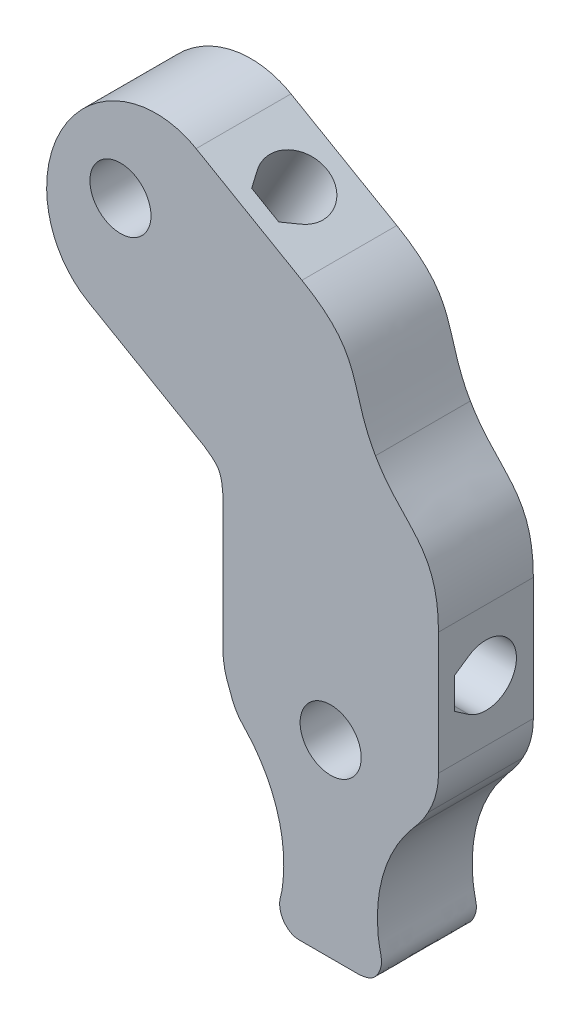
ISO-10303-21;
HEADER;
FILE_DESCRIPTION(('STEP AP214'),'2;1');
FILE_NAME('part.step','',(''),(''),'','','');
FILE_SCHEMA(('AUTOMOTIVE_DESIGN { 1 0 10303 214 1 1 1 1 }'));
ENDSEC;
DATA;
#1=APPLICATION_CONTEXT('core data for automotive mechanical design processes');
#2=APPLICATION_PROTOCOL_DEFINITION('international standard','automotive_design',2000,#1);
#3=PRODUCT_CONTEXT('',#1,'mechanical');
#4=PRODUCT('Part','Part','',(#3));
#5=PRODUCT_RELATED_PRODUCT_CATEGORY('part','',(#4));
#6=PRODUCT_DEFINITION_FORMATION('','',#4);
#7=PRODUCT_DEFINITION_CONTEXT('part definition',#1,'design');
#8=PRODUCT_DEFINITION('design','',#6,#7);
#9=PRODUCT_DEFINITION_SHAPE('','',#8);
#10=(LENGTH_UNIT() NAMED_UNIT(*) SI_UNIT(.MILLI.,.METRE.));
#11=(NAMED_UNIT(*) PLANE_ANGLE_UNIT() SI_UNIT($,.RADIAN.));
#12=(NAMED_UNIT(*) SI_UNIT($,.STERADIAN.) SOLID_ANGLE_UNIT());
#13=UNCERTAINTY_MEASURE_WITH_UNIT(LENGTH_MEASURE(1.E-05),#10,'distance_accuracy_value','');
#14=(GEOMETRIC_REPRESENTATION_CONTEXT(3) GLOBAL_UNCERTAINTY_ASSIGNED_CONTEXT((#13)) GLOBAL_UNIT_ASSIGNED_CONTEXT((#10,
#11,#12)) REPRESENTATION_CONTEXT('',''));
#15=CARTESIAN_POINT('',(0.,0.,0.));
#16=DIRECTION('',(0.,0.,1.));
#17=DIRECTION('',(1.,0.,0.));
#18=AXIS2_PLACEMENT_3D('',#15,#16,#17);
#19=CARTESIAN_POINT('',(0.,-30.2749907475931,6.6));
#20=DIRECTION('',(0.,0.,1.));
#21=DIRECTION('',(1.,0.,0.));
#22=AXIS2_PLACEMENT_3D('',#19,#20,#21);
#23=ELLIPSE('',#22,15.,12.681);
#24=DIRECTION('',(0.,0.,-1.));
#25=VECTOR('',#24,1.);
#26=SURFACE_OF_LINEAR_EXTRUSION('',#23,#25);
#27=DIRECTION('',(0.,0.,-1.));
#28=VECTOR('',#27,1.);
#29=CARTESIAN_POINT('',(-14.0996529992365,-34.6022320103913,0.));
#30=LINE('',#29,#28);
#31=CARTESIAN_POINT('',(-14.099652999238,-34.6022320103866,6.6));
#32=VERTEX_POINT('',#31);
#33=CARTESIAN_POINT('',(-14.099652999238,-34.6022320103866,-6.6));
#34=VERTEX_POINT('',#33);
#35=EDGE_CURVE('E12',#32,#34,#30,.T.);
#36=ORIENTED_EDGE('',*,*,#35,.F.);
#37=CARTESIAN_POINT('',(-15.,-30.2749907475931,6.6));
#38=VERTEX_POINT('',#37);
#39=EDGE_CURVE('E312',#38,#32,#23,.T.);
#40=ORIENTED_EDGE('',*,*,#39,.F.);
#41=DIRECTION('',(0.,0.,-1.));
#42=VECTOR('',#41,1.);
#43=CARTESIAN_POINT('',(-15.,-30.2749907475931,6.6));
#44=LINE('',#43,#42);
#45=CARTESIAN_POINT('',(-15.,-30.2749907475931,-6.6));
#46=VERTEX_POINT('',#45);
#47=EDGE_CURVE('E151',#38,#46,#44,.T.);
#48=ORIENTED_EDGE('',*,*,#47,.T.);
#49=CARTESIAN_POINT('',(0.,-30.2749907475931,-6.6));
#50=DIRECTION('',(0.,0.,1.));
#51=DIRECTION('',(1.,0.,0.));
#52=AXIS2_PLACEMENT_3D('',#49,#50,#51);
#53=ELLIPSE('',#52,15.,12.681);
#54=EDGE_CURVE('E486',#46,#34,#53,.T.);
#55=ORIENTED_EDGE('',*,*,#54,.T.);
#56=EDGE_LOOP('',(#36,#40,#48,#55));
#57=FACE_BOUND('',#56,.T.);
#58=ADVANCED_FACE('F140',(#57),#26,.F.);
#59=CARTESIAN_POINT('',(0.,-30.2749907475931,6.6));
#60=DIRECTION('',(0.,0.,1.));
#61=DIRECTION('',(1.,0.,0.));
#62=AXIS2_PLACEMENT_3D('',#59,#60,#61);
#63=PLANE('',#62);
#64=CARTESIAN_POINT('',(13.5215570159766,-35.7647228182937,6.6));
#65=VERTEX_POINT('',#64);
#66=CARTESIAN_POINT('',(15.,-30.2749907475932,6.6));
#67=VERTEX_POINT('',#66);
#68=EDGE_CURVE('E550',#65,#67,#23,.T.);
#69=ORIENTED_EDGE('',*,*,#68,.T.);
#70=DIRECTION('',(0.,-1.,0.));
#71=VECTOR('',#70,1.);
#72=CARTESIAN_POINT('',(15.,-13.2749907475933,6.6));
#73=LINE('',#72,#71);
#74=CARTESIAN_POINT('',(15.,-13.2749907475933,6.6));
#75=VERTEX_POINT('',#74);
#76=EDGE_CURVE('E558',#75,#67,#73,.T.);
#77=ORIENTED_EDGE('',*,*,#76,.F.);
#78=CARTESIAN_POINT('',(15.,-13.2749907475933,6.6));
#79=CARTESIAN_POINT('',(15.,-3.02796405891336,6.6));
#80=CARTESIAN_POINT('',(10.1063570974954,-3.10451473088878,6.6));
#81=CARTESIAN_POINT('',(6.2354735114352,3.60005231035195,6.6));
#82=B_SPLINE_CURVE_WITH_KNOTS('',3,(#78,#79,#80,#81),.UNSPECIFIED.,.F.,.F.,(4,4),(0.,1.),.UNSPECIFIED.);
#83=CARTESIAN_POINT('',(6.23547351143524,3.60005231035187,6.6));
#84=VERTEX_POINT('',#83);
#85=EDGE_CURVE('E572',#75,#84,#82,.T.);
#86=ORIENTED_EDGE('',*,*,#85,.T.);
#87=CARTESIAN_POINT('',(-3.99647922241902,19.6278764305633,6.6));
#88=CARTESIAN_POINT('',(4.87770620323494,14.5043630862233,6.6));
#89=CARTESIAN_POINT('',(2.36458992537499,10.3046193515926,6.6));
#90=CARTESIAN_POINT('',(6.23547351143524,3.60005231035187,6.6));
#91=B_SPLINE_CURVE_WITH_KNOTS('',3,(#87,#88,#89,#90),.UNSPECIFIED.,.F.,.F.,(4,4),(0.,1.),.UNSPECIFIED.);
#92=CARTESIAN_POINT('',(-3.99647922241902,19.6278764305633,6.6));
#93=VERTEX_POINT('',#92);
#94=EDGE_CURVE('E576',#93,#84,#91,.T.);
#95=ORIENTED_EDGE('',*,*,#94,.F.);
#96=DIRECTION('',(-0.866025403784441,0.499999999999996,0.));
#97=VECTOR('',#96,1.);
#98=CARTESIAN_POINT('',(-3.99647922241902,19.6278764305633,6.6));
#99=LINE('',#98,#97);
#100=CARTESIAN_POINT('',(-18.7189110867546,28.1278764305632,6.6));
#101=VERTEX_POINT('',#100);
#102=EDGE_CURVE('E535',#93,#101,#99,.T.);
#103=ORIENTED_EDGE('',*,*,#102,.T.);
#104=CARTESIAN_POINT('',(-26.2189110867545,15.1374953737965,6.6));
#105=DIRECTION('',(0.,0.,-1.));
#106=DIRECTION('',(0.49999999999999,0.866025403784445,0.));
#107=AXIS2_PLACEMENT_3D('',#104,#105,#106);
#108=ELLIPSE('',#107,15.,12.681);
#109=CARTESIAN_POINT('',(-33.7189110867545,2.14711431703005,6.6));
#110=VERTEX_POINT('',#109);
#111=EDGE_CURVE('E530',#110,#101,#108,.T.);
#112=ORIENTED_EDGE('',*,*,#111,.F.);
#113=DIRECTION('',(-0.866025403784438,0.500000000000002,0.));
#114=VECTOR('',#113,1.);
#115=CARTESIAN_POINT('',(-18.996479222419,-6.35288568297003,6.6));
#116=LINE('',#115,#114);
#117=CARTESIAN_POINT('',(-18.996479222419,-6.35288568297003,6.6));
#118=VERTEX_POINT('',#117);
#119=EDGE_CURVE('E534',#118,#110,#116,.T.);
#120=ORIENTED_EDGE('',*,*,#119,.F.);
#121=CARTESIAN_POINT('',(-18.996479222419,-6.35288568297003,6.6));
#122=CARTESIAN_POINT('',(-16.8990015137658,-7.4384009621155,6.6));
#123=CARTESIAN_POINT('',(-15.9160989893475,-8.40880751728888,6.6));
#124=CARTESIAN_POINT('',(-15.5781947047634,-8.99407490628362,6.6));
#125=B_SPLINE_CURVE_WITH_KNOTS('',3,(#121,#122,#123,#124),.UNSPECIFIED.,.F.,.F.,(4,4),(0.,1.),.UNSPECIFIED.);
#126=CARTESIAN_POINT('',(-15.5781947047634,-8.99407490628362,6.6));
#127=VERTEX_POINT('',#126);
#128=EDGE_CURVE('E499',#118,#127,#125,.T.);
#129=ORIENTED_EDGE('',*,*,#128,.T.);
#130=CARTESIAN_POINT('',(-15.,-13.2749907475931,6.6));
#131=CARTESIAN_POINT('',(-14.8913449536095,-10.9157641284551,6.6));
#132=CARTESIAN_POINT('',(-15.2402904201794,-9.57934229527836,6.6));
#133=CARTESIAN_POINT('',(-15.5781947047634,-8.99407490628362,6.6));
#134=B_SPLINE_CURVE_WITH_KNOTS('',3,(#130,#131,#132,#133),.UNSPECIFIED.,.F.,.F.,(4,4),(0.,1.),.UNSPECIFIED.);
#135=CARTESIAN_POINT('',(-15.,-13.2749907475931,6.6));
#136=VERTEX_POINT('',#135);
#137=EDGE_CURVE('E440',#136,#127,#134,.T.);
#138=ORIENTED_EDGE('',*,*,#137,.F.);
#139=DIRECTION('',(0.,-1.,0.));
#140=VECTOR('',#139,1.);
#141=CARTESIAN_POINT('',(-15.,-13.2749907475931,6.6));
#142=LINE('',#141,#140);
#143=EDGE_CURVE('E446',#136,#38,#142,.T.);
#144=ORIENTED_EDGE('',*,*,#143,.T.);
#145=ORIENTED_EDGE('',*,*,#39,.T.);
#146=CARTESIAN_POINT('',(-15.,-30.2749907475931,6.6));
#147=CARTESIAN_POINT('',(-14.2865523426086,-35.6426745631836,6.6));
#148=CARTESIAN_POINT('',(-12.5655065854139,-37.6555101928118,6.6));
#149=B_SPLINE_CURVE_WITH_KNOTS('',2,(#146,#147,#148),.UNSPECIFIED.,.F.,.F.,(3,3),(0.,1.),.UNSPECIFIED.);
#150=CARTESIAN_POINT('',(-12.5655065854139,-37.6555101928118,6.6));
#151=VERTEX_POINT('',#150);
#152=EDGE_CURVE('E304',#32,#151,#149,.T.);
#153=ORIENTED_EDGE('',*,*,#152,.T.);
#154=CARTESIAN_POINT('',(-4.10506744026298,-60.0556221573633,6.6));
#155=CARTESIAN_POINT('',(-4.45974012122379,-60.0586342130783,6.6));
#156=CARTESIAN_POINT('',(-5.3097351628524,-60.0367639684987,6.6));
#157=CARTESIAN_POINT('',(-6.71086481535362,-58.9880064881459,6.6));
#158=CARTESIAN_POINT('',(-7.147854357688,-57.5204737854024,6.6));
#159=CARTESIAN_POINT('',(-7.07235122847969,-56.5128627220298,6.6));
#160=CARTESIAN_POINT('',(-6.77003596733258,-55.5054039661602,6.6));
#161=CARTESIAN_POINT('',(-6.60636225986336,-54.0160115728545,6.6));
#162=CARTESIAN_POINT('',(-6.48655713896897,-52.0263053493098,6.6));
#163=CARTESIAN_POINT('',(-6.59066820123709,-50.0303307362697,6.6));
#164=CARTESIAN_POINT('',(-6.88819338677669,-48.0560177348259,6.6));
#165=CARTESIAN_POINT('',(-7.38153080490078,-46.1204443240831,6.6));
#166=CARTESIAN_POINT('',(-8.06300977398602,-44.2434766765483,6.6));
#167=CARTESIAN_POINT('',(-8.92957940953793,-42.4433750059924,6.6));
#168=CARTESIAN_POINT('',(-9.97736628640268,-40.7456102045273,6.6));
#169=CARTESIAN_POINT('',(-11.0140943295074,-39.3219788827491,6.6));
#170=CARTESIAN_POINT('',(-11.9646821855968,-38.3696440749146,6.6));
#171=CARTESIAN_POINT('',(-12.4063386771834,-37.85325361509,6.6));
#172=CARTESIAN_POINT('',(-12.5655065854139,-37.6555101928118,6.6));
#173=B_SPLINE_CURVE_WITH_KNOTS('',3,(#154,#155,#156,#157,#158,#159,#160,#161,#162,#163,#164,
#165,#166,#167,#168,#169,#170,#171,#172),.UNSPECIFIED.,.F.,.F.,(4,1,1,1,1,1,1,1,1,1,1,1,1,1,1,1,
4),(0.,0.0276595465617291,0.0833367375974978,0.139000984117367,0.159159574138172,
0.173630482588283,0.233516851180277,0.293375318961064,0.353233786741972,0.413120141176518,
0.472984650221981,0.532856343906258,0.592727518195394,0.652578768876378,0.712466067856139,
0.750774856026475,0.773630262322771),.UNSPECIFIED.);
#174=CARTESIAN_POINT('',(-4.10506744026298,-60.0556221573633,6.6));
#175=VERTEX_POINT('',#174);
#176=EDGE_CURVE('E309',#175,#151,#173,.T.);
#177=ORIENTED_EDGE('',*,*,#176,.F.);
#178=DIRECTION('',(-1.,0.,0.));
#179=VECTOR('',#178,1.);
#180=CARTESIAN_POINT('',(4.02176212476966,-60.0556221573632,6.6));
#181=LINE('',#180,#179);
#182=CARTESIAN_POINT('',(4.02176212476966,-60.0556221573632,6.6));
#183=VERTEX_POINT('',#182);
#184=EDGE_CURVE('E340',#183,#175,#181,.T.);
#185=ORIENTED_EDGE('',*,*,#184,.F.);
#186=CARTESIAN_POINT('',(11.5500336561995,-38.5506329070779,6.6));
#187=CARTESIAN_POINT('',(11.2218418277643,-38.9150988814468,6.6));
#188=CARTESIAN_POINT('',(10.9059553927574,-39.4003247277423,6.6));
#189=CARTESIAN_POINT('',(9.69314969657623,-40.9809836822724,6.6));
#190=CARTESIAN_POINT('',(8.6672807259953,-42.740319033252,6.6));
#191=CARTESIAN_POINT('',(7.67661927421356,-45.075200557631,6.6));
#192=CARTESIAN_POINT('',(7.08898158808682,-46.9825237443114,6.6));
#193=CARTESIAN_POINT('',(6.69361949445008,-48.9400702496253,6.6));
#194=CARTESIAN_POINT('',(6.49244524652297,-50.927900735681,6.6));
#195=CARTESIAN_POINT('',(6.50457602458208,-52.9226684538639,6.6));
#196=CARTESIAN_POINT('',(6.64408363801613,-54.747020658482,6.6));
#197=CARTESIAN_POINT('',(6.99868025882105,-56.0861809714479,6.6));
#198=CARTESIAN_POINT('',(7.14935911050724,-57.4154972317194,6.6));
#199=CARTESIAN_POINT('',(6.58169133728172,-58.921504763906,6.6));
#200=CARTESIAN_POINT('',(5.56989677384647,-59.8597206957537,6.6));
#201=CARTESIAN_POINT('',(4.06778531677864,-60.0621199701103,6.6));
#202=CARTESIAN_POINT('',(4.02176212476966,-60.0556221573632,6.6));
#203=B_SPLINE_CURVE_WITH_KNOTS('',3,(#186,#187,#188,#189,#190,#191,#192,#193,#194,#195,#196,
#197,#198,#199,#200,#201,#202),.UNSPECIFIED.,.F.,.F.,(4,1,1,1,1,1,1,1,1,1,1,1,1,1,4),
(0.416114245345297,0.45364675697124,0.468506228789404,0.553584024284118,0.600937776952884,
0.648267117097113,0.695592694166175,0.742926149296005,0.790263011776007,0.837596466905927,
0.872691441009403,0.888628806676144,0.932636916887851,0.976655261023808,1.),.UNSPECIFIED.);
#204=CARTESIAN_POINT('',(11.5500336561995,-38.5506329070779,6.6));
#205=VERTEX_POINT('',#204);
#206=EDGE_CURVE('E346',#205,#183,#203,.T.);
#207=ORIENTED_EDGE('',*,*,#206,.F.);
#208=CARTESIAN_POINT('',(15.,-30.2749907475932,6.6));
#209=CARTESIAN_POINT('',(14.7198907893044,-35.0920850558884,6.6));
#210=CARTESIAN_POINT('',(11.5500336561995,-38.5506329070779,6.6));
#211=B_SPLINE_CURVE_WITH_KNOTS('',2,(#208,#209,#210),.UNSPECIFIED.,.F.,.F.,(3,3),(0.,1.),.UNSPECIFIED.);
#212=EDGE_CURVE('E352',#65,#205,#211,.T.);
#213=ORIENTED_EDGE('',*,*,#212,.F.);
#214=EDGE_LOOP('',(#69,#77,#86,#95,#103,#112,#120,#129,#138,#144,#145,#153,#177,#185,#207,#213));
#215=FACE_BOUND('',#214,.T.);
#216=CARTESIAN_POINT('',(-29.25,16.8874953737966,6.6));
#217=DIRECTION('',(0.,0.,1.));
#218=DIRECTION('',(1.,0.,0.));
#219=AXIS2_PLACEMENT_3D('',#216,#217,#218);
#220=CIRCLE('',#219,4.25000000000001);
#221=CARTESIAN_POINT('',(-25.,16.8874953737966,6.6));
#222=VERTEX_POINT('',#221);
#223=EDGE_CURVE('E493',#222,#222,#220,.F.);
#224=ORIENTED_EDGE('',*,*,#223,.T.);
#225=EDGE_LOOP('',(#224));
#226=FACE_BOUND('',#225,.T.);
#227=CARTESIAN_POINT('',(0.,-33.7749907475931,6.6));
#228=DIRECTION('',(0.,0.,1.));
#229=DIRECTION('',(1.,0.,0.));
#230=AXIS2_PLACEMENT_3D('',#227,#228,#229);
#231=CIRCLE('',#230,4.25000000000001);
#232=CARTESIAN_POINT('',(4.25000000000001,-33.7749907475931,6.6));
#233=VERTEX_POINT('',#232);
#234=EDGE_CURVE('E726',#233,#233,#231,.T.);
#235=ORIENTED_EDGE('',*,*,#234,.F.);
#236=EDGE_LOOP('',(#235));
#237=FACE_BOUND('',#236,.T.);
#238=ADVANCED_FACE('F306',(#215,#226,#237),#63,.T.);
#239=CARTESIAN_POINT('',(0.,-30.2749907475931,-6.6));
#240=DIRECTION('',(0.,0.,1.));
#241=DIRECTION('',(1.,0.,0.));
#242=AXIS2_PLACEMENT_3D('',#239,#240,#241);
#243=PLANE('',#242);
#244=CARTESIAN_POINT('',(13.5215570159766,-35.7647228182937,-6.6));
#245=VERTEX_POINT('',#244);
#246=CARTESIAN_POINT('',(15.,-30.2749907475932,-6.6));
#247=VERTEX_POINT('',#246);
#248=EDGE_CURVE('E489',#245,#247,#53,.T.);
#249=ORIENTED_EDGE('',*,*,#248,.F.);
#250=CARTESIAN_POINT('',(15.,-30.2749907475932,-6.6));
#251=CARTESIAN_POINT('',(14.7198907893044,-35.0920850558884,-6.6));
#252=CARTESIAN_POINT('',(11.5500336561995,-38.5506329070779,-6.6));
#253=B_SPLINE_CURVE_WITH_KNOTS('',2,(#250,#251,#252),.UNSPECIFIED.,.F.,.F.,(3,3),(0.,1.),.UNSPECIFIED.);
#254=CARTESIAN_POINT('',(11.5500336561995,-38.5506329070779,-6.6));
#255=VERTEX_POINT('',#254);
#256=EDGE_CURVE('E159',#245,#255,#253,.T.);
#257=ORIENTED_EDGE('',*,*,#256,.T.);
#258=CARTESIAN_POINT('',(4.02176212476966,-60.0556221573632,-6.6));
#259=CARTESIAN_POINT('',(4.06778531677864,-60.0621199701103,-6.6));
#260=CARTESIAN_POINT('',(5.56989677384647,-59.8597206957537,-6.6));
#261=CARTESIAN_POINT('',(6.58169133728172,-58.921504763906,-6.6));
#262=CARTESIAN_POINT('',(7.14935911050724,-57.4154972317194,-6.6));
#263=CARTESIAN_POINT('',(6.99868025882105,-56.0861809714479,-6.6));
#264=CARTESIAN_POINT('',(6.64408363801613,-54.747020658482,-6.6));
#265=CARTESIAN_POINT('',(6.50457602458208,-52.9226684538639,-6.6));
#266=CARTESIAN_POINT('',(6.49244524652297,-50.927900735681,-6.6));
#267=CARTESIAN_POINT('',(6.69361949445008,-48.9400702496253,-6.6));
#268=CARTESIAN_POINT('',(7.08898158808682,-46.9825237443114,-6.6));
#269=CARTESIAN_POINT('',(7.67661927421356,-45.075200557631,-6.6));
#270=CARTESIAN_POINT('',(8.6672807259953,-42.740319033252,-6.6));
#271=CARTESIAN_POINT('',(9.69314969657623,-40.9809836822724,-6.6));
#272=CARTESIAN_POINT('',(10.9059553927574,-39.4003247277423,-6.6));
#273=CARTESIAN_POINT('',(11.2218418277643,-38.9150988814468,-6.6));
#274=CARTESIAN_POINT('',(11.5500336561995,-38.5506329070779,-6.6));
#275=B_SPLINE_CURVE_WITH_KNOTS('',3,(#258,#259,#260,#261,#262,#263,#264,#265,#266,#267,#268,
#269,#270,#271,#272,#273,#274),.UNSPECIFIED.,.F.,.F.,(4,1,1,1,1,1,1,1,1,1,1,1,1,1,4),
(0.416114245345297,0.439458984321489,0.483477328457446,0.527485438669153,0.543422804335894,
0.57851777843937,0.625851233569291,0.673188096049293,0.720521551179122,0.767847128248184,
0.815176468392414,0.86253022106118,0.947608016555894,0.962467488374058,1.),.UNSPECIFIED.);
#276=CARTESIAN_POINT('',(4.02176212476966,-60.0556221573632,-6.6));
#277=VERTEX_POINT('',#276);
#278=EDGE_CURVE('E329',#255,#277,#275,.F.);
#279=ORIENTED_EDGE('',*,*,#278,.T.);
#280=DIRECTION('',(-1.,0.,0.));
#281=VECTOR('',#280,1.);
#282=CARTESIAN_POINT('',(4.02176212476966,-60.0556221573632,-6.6));
#283=LINE('',#282,#281);
#284=CARTESIAN_POINT('',(-4.10506744026298,-60.0556221573633,-6.6));
#285=VERTEX_POINT('',#284);
#286=EDGE_CURVE('E315',#277,#285,#283,.T.);
#287=ORIENTED_EDGE('',*,*,#286,.T.);
#288=CARTESIAN_POINT('',(-4.10506744026298,-60.0556221573633,-6.6));
#289=CARTESIAN_POINT('',(-4.45974012122379,-60.0586342130783,-6.6));
#290=CARTESIAN_POINT('',(-5.3097351628524,-60.0367639684987,-6.6));
#291=CARTESIAN_POINT('',(-6.71086481535362,-58.9880064881459,-6.6));
#292=CARTESIAN_POINT('',(-7.147854357688,-57.5204737854024,-6.6));
#293=CARTESIAN_POINT('',(-7.07235122847969,-56.5128627220298,-6.6));
#294=CARTESIAN_POINT('',(-6.77003596733258,-55.5054039661602,-6.6));
#295=CARTESIAN_POINT('',(-6.60636225986336,-54.0160115728545,-6.6));
#296=CARTESIAN_POINT('',(-6.48655713896897,-52.0263053493098,-6.6));
#297=CARTESIAN_POINT('',(-6.59066820123709,-50.0303307362697,-6.6));
#298=CARTESIAN_POINT('',(-6.88819338677669,-48.0560177348259,-6.6));
#299=CARTESIAN_POINT('',(-7.38153080490078,-46.1204443240831,-6.6));
#300=CARTESIAN_POINT('',(-8.06300977398602,-44.2434766765483,-6.6));
#301=CARTESIAN_POINT('',(-8.92957940953793,-42.4433750059924,-6.6));
#302=CARTESIAN_POINT('',(-9.97736628640268,-40.7456102045273,-6.6));
#303=CARTESIAN_POINT('',(-11.0140943295074,-39.3219788827491,-6.6));
#304=CARTESIAN_POINT('',(-11.9646821855968,-38.3696440749146,-6.6));
#305=CARTESIAN_POINT('',(-12.4063386771834,-37.85325361509,-6.6));
#306=CARTESIAN_POINT('',(-12.5655065854139,-37.6555101928118,-6.6));
#307=B_SPLINE_CURVE_WITH_KNOTS('',3,(#288,#289,#290,#291,#292,#293,#294,#295,#296,#297,#298,
#299,#300,#301,#302,#303,#304,#305,#306),.UNSPECIFIED.,.F.,.F.,(4,1,1,1,1,1,1,1,1,1,1,1,1,1,1,1,
4),(0.,0.0276595465617291,0.0833367375974978,0.139000984117367,0.159159574138172,
0.173630482588283,0.233516851180277,0.293375318961064,0.353233786741972,0.413120141176518,
0.472984650221981,0.532856343906258,0.592727518195394,0.652578768876378,0.712466067856139,
0.750774856026475,0.773630262322771),.UNSPECIFIED.);
#308=CARTESIAN_POINT('',(-12.5655065854139,-37.6555101928118,-6.6));
#309=VERTEX_POINT('',#308);
#310=EDGE_CURVE('E336',#285,#309,#307,.T.);
#311=ORIENTED_EDGE('',*,*,#310,.T.);
#312=CARTESIAN_POINT('',(-15.,-30.2749907475931,-6.6));
#313=CARTESIAN_POINT('',(-14.2865523426086,-35.6426745631836,-6.6));
#314=CARTESIAN_POINT('',(-12.5655065854139,-37.6555101928118,-6.6));
#315=B_SPLINE_CURVE_WITH_KNOTS('',2,(#312,#313,#314),.UNSPECIFIED.,.F.,.F.,(3,3),(0.,1.),.UNSPECIFIED.);
#316=EDGE_CURVE('E321',#34,#309,#315,.T.);
#317=ORIENTED_EDGE('',*,*,#316,.F.);
#318=ORIENTED_EDGE('',*,*,#54,.F.);
#319=DIRECTION('',(0.,-1.,0.));
#320=VECTOR('',#319,1.);
#321=CARTESIAN_POINT('',(-15.,-13.2749907475931,-6.6));
#322=LINE('',#321,#320);
#323=CARTESIAN_POINT('',(-15.,-13.2749907475931,-6.6));
#324=VERTEX_POINT('',#323);
#325=EDGE_CURVE('E490',#324,#46,#322,.T.);
#326=ORIENTED_EDGE('',*,*,#325,.F.);
#327=CARTESIAN_POINT('',(-15.,-13.2749907475931,-6.6));
#328=CARTESIAN_POINT('',(-14.8913449536095,-10.9157641284551,-6.6));
#329=CARTESIAN_POINT('',(-15.2402904201794,-9.57934229527836,-6.6));
#330=CARTESIAN_POINT('',(-15.5781947047634,-8.99407490628362,-6.6));
#331=B_SPLINE_CURVE_WITH_KNOTS('',3,(#327,#328,#329,#330),.UNSPECIFIED.,.F.,.F.,(4,4),(0.,1.),.UNSPECIFIED.);
#332=CARTESIAN_POINT('',(-15.5781947047634,-8.99407490628362,-6.6));
#333=VERTEX_POINT('',#332);
#334=EDGE_CURVE('E441',#324,#333,#331,.T.);
#335=ORIENTED_EDGE('',*,*,#334,.T.);
#336=CARTESIAN_POINT('',(-18.996479222419,-6.35288568297003,-6.6));
#337=CARTESIAN_POINT('',(-16.8990015137658,-7.4384009621155,-6.6));
#338=CARTESIAN_POINT('',(-15.9160989893475,-8.40880751728888,-6.6));
#339=CARTESIAN_POINT('',(-15.5781947047634,-8.99407490628362,-6.6));
#340=B_SPLINE_CURVE_WITH_KNOTS('',3,(#336,#337,#338,#339),.UNSPECIFIED.,.F.,.F.,(4,4),(0.,1.),.UNSPECIFIED.);
#341=CARTESIAN_POINT('',(-18.996479222419,-6.35288568297003,-6.6));
#342=VERTEX_POINT('',#341);
#343=EDGE_CURVE('E447',#342,#333,#340,.T.);
#344=ORIENTED_EDGE('',*,*,#343,.F.);
#345=DIRECTION('',(-0.866025403784438,0.500000000000002,0.));
#346=VECTOR('',#345,1.);
#347=CARTESIAN_POINT('',(-18.996479222419,-6.35288568297003,-6.6));
#348=LINE('',#347,#346);
#349=CARTESIAN_POINT('',(-33.7189110867545,2.14711431703005,-6.6));
#350=VERTEX_POINT('',#349);
#351=EDGE_CURVE('E455',#342,#350,#348,.T.);
#352=ORIENTED_EDGE('',*,*,#351,.T.);
#353=CARTESIAN_POINT('',(-26.2189110867545,15.1374953737965,-6.6));
#354=DIRECTION('',(0.,0.,-1.));
#355=DIRECTION('',(0.49999999999999,0.866025403784445,0.));
#356=AXIS2_PLACEMENT_3D('',#353,#354,#355);
#357=ELLIPSE('',#356,15.,12.681);
#358=CARTESIAN_POINT('',(-18.7189110867546,28.1278764305632,-6.6));
#359=VERTEX_POINT('',#358);
#360=EDGE_CURVE('E461',#350,#359,#357,.T.);
#361=ORIENTED_EDGE('',*,*,#360,.T.);
#362=DIRECTION('',(-0.866025403784441,0.499999999999996,0.));
#363=VECTOR('',#362,1.);
#364=CARTESIAN_POINT('',(-3.99647922241902,19.6278764305633,-6.6));
#365=LINE('',#364,#363);
#366=CARTESIAN_POINT('',(-3.99647922241902,19.6278764305633,-6.6));
#367=VERTEX_POINT('',#366);
#368=EDGE_CURVE('E464',#367,#359,#365,.T.);
#369=ORIENTED_EDGE('',*,*,#368,.F.);
#370=CARTESIAN_POINT('',(-3.99647922241902,19.6278764305633,-6.6));
#371=CARTESIAN_POINT('',(4.87770620323494,14.5043630862233,-6.6));
#372=CARTESIAN_POINT('',(2.36458992537499,10.3046193515926,-6.6));
#373=CARTESIAN_POINT('',(6.23547351143524,3.60005231035187,-6.6));
#374=B_SPLINE_CURVE_WITH_KNOTS('',3,(#370,#371,#372,#373),.UNSPECIFIED.,.F.,.F.,(4,4),(0.,1.),.UNSPECIFIED.);
#375=CARTESIAN_POINT('',(6.23547351143524,3.60005231035187,-6.6));
#376=VERTEX_POINT('',#375);
#377=EDGE_CURVE('E467',#367,#376,#374,.T.);
#378=ORIENTED_EDGE('',*,*,#377,.T.);
#379=CARTESIAN_POINT('',(15.,-13.2749907475933,-6.6));
#380=CARTESIAN_POINT('',(15.,-3.02796405891336,-6.6));
#381=CARTESIAN_POINT('',(10.1063570974954,-3.10451473088878,-6.6));
#382=CARTESIAN_POINT('',(6.2354735114352,3.60005231035195,-6.6));
#383=B_SPLINE_CURVE_WITH_KNOTS('',3,(#379,#380,#381,#382),.UNSPECIFIED.,.F.,.F.,(4,4),(0.,1.),.UNSPECIFIED.);
#384=CARTESIAN_POINT('',(15.,-13.2749907475933,-6.6));
#385=VERTEX_POINT('',#384);
#386=EDGE_CURVE('E472',#385,#376,#383,.T.);
#387=ORIENTED_EDGE('',*,*,#386,.F.);
#388=DIRECTION('',(0.,-1.,0.));
#389=VECTOR('',#388,1.);
#390=CARTESIAN_POINT('',(15.,-13.2749907475933,-6.6));
#391=LINE('',#390,#389);
#392=EDGE_CURVE('E480',#385,#247,#391,.T.);
#393=ORIENTED_EDGE('',*,*,#392,.T.);
#394=EDGE_LOOP('',(#249,#257,#279,#287,#311,#317,#318,#326,#335,#344,#352,#361,#369,#378,#387,#393));
#395=FACE_BOUND('',#394,.T.);
#396=CARTESIAN_POINT('',(-29.25,16.8874953737966,-6.6));
#397=DIRECTION('',(0.,0.,1.));
#398=DIRECTION('',(1.,0.,0.));
#399=AXIS2_PLACEMENT_3D('',#396,#397,#398);
#400=CIRCLE('',#399,4.25000000000001);
#401=CARTESIAN_POINT('',(-25.,16.8874953737966,-6.6));
#402=VERTEX_POINT('',#401);
#403=EDGE_CURVE('E554',#402,#402,#400,.F.);
#404=ORIENTED_EDGE('',*,*,#403,.F.);
#405=EDGE_LOOP('',(#404));
#406=FACE_BOUND('',#405,.T.);
#407=CARTESIAN_POINT('',(0.,-33.7749907475931,-6.6));
#408=DIRECTION('',(0.,0.,1.));
#409=DIRECTION('',(1.,0.,0.));
#410=AXIS2_PLACEMENT_3D('',#407,#408,#409);
#411=CIRCLE('',#410,4.25000000000001);
#412=CARTESIAN_POINT('',(4.25000000000001,-33.7749907475931,-6.6));
#413=VERTEX_POINT('',#412);
#414=EDGE_CURVE('E725',#413,#413,#411,.T.);
#415=ORIENTED_EDGE('',*,*,#414,.T.);
#416=EDGE_LOOP('',(#415));
#417=FACE_BOUND('',#416,.T.);
#418=ADVANCED_FACE('F416',(#395,#406,#417),#243,.F.);
#419=CARTESIAN_POINT('',(-15.,-13.2749907475931,6.6));
#420=DIRECTION('',(1.,0.,0.));
#421=DIRECTION('',(0.,1.,0.));
#422=AXIS2_PLACEMENT_3D('',#419,#420,#421);
#423=PLANE('',#422);
#424=DIRECTION('',(0.,-1.,0.));
#425=VECTOR('',#424,1.);
#426=CARTESIAN_POINT('',(-15.,-23.9499907475933,4.35));
#427=LINE('',#426,#425);
#428=CARTESIAN_POINT('',(-15.,-19.5999907475933,4.35));
#429=VERTEX_POINT('',#428);
#430=CARTESIAN_POINT('',(-15.,-23.9499907475933,4.35));
#431=VERTEX_POINT('',#430);
#432=EDGE_CURVE('E696',#429,#431,#427,.T.);
#433=ORIENTED_EDGE('',*,*,#432,.T.);
#434=DIRECTION('',(0.,0.564188482461599,0.825646023582551));
#435=VECTOR('',#434,1.);
#436=CARTESIAN_POINT('',(-15.,-23.9499907475933,4.34999999999999));
#437=LINE('',#436,#435);
#438=CARTESIAN_POINT('',(-15.,-25.2839863478191,2.39780105046179));
#439=VERTEX_POINT('',#438);
#440=EDGE_CURVE('E699',#439,#431,#437,.T.);
#441=ORIENTED_EDGE('',*,*,#440,.F.);
#442=CARTESIAN_POINT('',(-15.,-21.7749907475933,0.));
#443=DIRECTION('',(1.,0.,0.));
#444=DIRECTION('',(0.,1.,0.));
#445=AXIS2_PLACEMENT_3D('',#442,#443,#444);
#446=CIRCLE('',#445,4.25);
#447=CARTESIAN_POINT('',(-15.,-18.2659951473674,2.39780105046179));
#448=VERTEX_POINT('',#447);
#449=EDGE_CURVE('E716',#448,#439,#446,.F.);
#450=ORIENTED_EDGE('',*,*,#449,.F.);
#451=DIRECTION('',(0.,-0.564188482461599,0.825646023582551));
#452=VECTOR('',#451,1.);
#453=CARTESIAN_POINT('',(-15.,-19.5999907475933,4.35000000000001));
#454=LINE('',#453,#452);
#455=EDGE_CURVE('E693',#448,#429,#454,.T.);
#456=ORIENTED_EDGE('',*,*,#455,.T.);
#457=EDGE_LOOP('',(#433,#441,#450,#456));
#458=FACE_BOUND('',#457,.T.);
#459=ORIENTED_EDGE('',*,*,#325,.T.);
#460=ORIENTED_EDGE('',*,*,#47,.F.);
#461=ORIENTED_EDGE('',*,*,#143,.F.);
#462=DIRECTION('',(0.,0.,-1.));
#463=VECTOR('',#462,1.);
#464=CARTESIAN_POINT('',(-15.,-13.2749907475931,6.6));
#465=LINE('',#464,#463);
#466=EDGE_CURVE('E438',#136,#324,#465,.T.);
#467=ORIENTED_EDGE('',*,*,#466,.T.);
#468=EDGE_LOOP('',(#459,#460,#461,#467));
#469=FACE_BOUND('',#468,.T.);
#470=ADVANCED_FACE('F142',(#458,#469),#423,.F.);
#471=ORIENTED_EDGE('',*,*,#68,.F.);
#472=DIRECTION('',(0.,0.,-1.));
#473=VECTOR('',#472,1.);
#474=CARTESIAN_POINT('',(13.5215570159766,-35.7647228182937,0.));
#475=LINE('',#474,#473);
#476=EDGE_CURVE('E368',#65,#245,#475,.T.);
#477=ORIENTED_EDGE('',*,*,#476,.T.);
#478=ORIENTED_EDGE('',*,*,#248,.T.);
#479=DIRECTION('',(0.,0.,-1.));
#480=VECTOR('',#479,1.);
#481=CARTESIAN_POINT('',(15.,-30.2749907475932,6.6));
#482=LINE('',#481,#480);
#483=EDGE_CURVE('E421',#67,#247,#482,.T.);
#484=ORIENTED_EDGE('',*,*,#483,.F.);
#485=EDGE_LOOP('',(#471,#477,#478,#484));
#486=FACE_BOUND('',#485,.T.);
#487=ADVANCED_FACE('F560',(#486),#26,.F.);
#488=CARTESIAN_POINT('',(15.,-13.2749907475933,6.6));
#489=DIRECTION('',(1.,0.,0.));
#490=DIRECTION('',(0.,1.,0.));
#491=AXIS2_PLACEMENT_3D('',#488,#489,#490);
#492=PLANE('',#491);
#493=DIRECTION('',(0.,-0.564188482461599,-0.825646023582551));
#494=VECTOR('',#493,1.);
#495=CARTESIAN_POINT('',(15.,-23.9499907475932,4.35));
#496=LINE('',#495,#494);
#497=CARTESIAN_POINT('',(15.,-23.9499907475932,4.35));
#498=VERTEX_POINT('',#497);
#499=CARTESIAN_POINT('',(15.,-25.2839863478191,2.39780105046179));
#500=VERTEX_POINT('',#499);
#501=EDGE_CURVE('E702',#498,#500,#496,.T.);
#502=ORIENTED_EDGE('',*,*,#501,.F.);
#503=DIRECTION('',(0.,1.,0.));
#504=VECTOR('',#503,1.);
#505=CARTESIAN_POINT('',(15.,-23.9499907475932,4.35));
#506=LINE('',#505,#504);
#507=CARTESIAN_POINT('',(15.,-19.5999907475932,4.35));
#508=VERTEX_POINT('',#507);
#509=EDGE_CURVE('E710',#498,#508,#506,.T.);
#510=ORIENTED_EDGE('',*,*,#509,.T.);
#511=DIRECTION('',(0.,0.564188482461599,-0.825646023582551));
#512=VECTOR('',#511,1.);
#513=CARTESIAN_POINT('',(15.,-19.5999907475932,4.35));
#514=LINE('',#513,#512);
#515=CARTESIAN_POINT('',(15.,-18.2659951473674,2.39780105046179));
#516=VERTEX_POINT('',#515);
#517=EDGE_CURVE('E707',#508,#516,#514,.T.);
#518=ORIENTED_EDGE('',*,*,#517,.T.);
#519=CARTESIAN_POINT('',(15.,-21.7749907475932,0.));
#520=DIRECTION('',(1.,0.,0.));
#521=DIRECTION('',(0.,1.,0.));
#522=AXIS2_PLACEMENT_3D('',#519,#520,#521);
#523=CIRCLE('',#522,4.25);
#524=EDGE_CURVE('E704',#500,#516,#523,.T.);
#525=ORIENTED_EDGE('',*,*,#524,.F.);
#526=EDGE_LOOP('',(#502,#510,#518,#525));
#527=FACE_BOUND('',#526,.T.);
#528=ORIENTED_EDGE('',*,*,#392,.F.);
#529=DIRECTION('',(0.,0.,-1.));
#530=VECTOR('',#529,1.);
#531=CARTESIAN_POINT('',(15.,-13.2749907475933,6.6));
#532=LINE('',#531,#530);
#533=EDGE_CURVE('E424',#75,#385,#532,.T.);
#534=ORIENTED_EDGE('',*,*,#533,.F.);
#535=ORIENTED_EDGE('',*,*,#76,.T.);
#536=ORIENTED_EDGE('',*,*,#483,.T.);
#537=EDGE_LOOP('',(#528,#534,#535,#536));
#538=FACE_BOUND('',#537,.T.);
#539=ADVANCED_FACE('F563',(#527,#538),#492,.T.);
#540=DIRECTION('',(0.,0.,-1.));
#541=VECTOR('',#540,1.);
#542=SURFACE_OF_LINEAR_EXTRUSION('',#82,#541);
#543=ORIENTED_EDGE('',*,*,#386,.T.);
#544=DIRECTION('',(0.,0.,-1.));
#545=VECTOR('',#544,1.);
#546=CARTESIAN_POINT('',(6.23547351143524,3.60005231035187,6.6));
#547=LINE('',#546,#545);
#548=EDGE_CURVE('E426',#84,#376,#547,.T.);
#549=ORIENTED_EDGE('',*,*,#548,.F.);
#550=ORIENTED_EDGE('',*,*,#85,.F.);
#551=ORIENTED_EDGE('',*,*,#533,.T.);
#552=EDGE_LOOP('',(#543,#549,#550,#551));
#553=FACE_BOUND('',#552,.T.);
#554=ADVANCED_FACE('F567',(#553),#542,.F.);
#555=DIRECTION('',(0.,0.,-1.));
#556=VECTOR('',#555,1.);
#557=SURFACE_OF_LINEAR_EXTRUSION('',#91,#556);
#558=ORIENTED_EDGE('',*,*,#377,.F.);
#559=DIRECTION('',(0.,0.,-1.));
#560=VECTOR('',#559,1.);
#561=CARTESIAN_POINT('',(-3.99647922241902,19.6278764305633,6.6));
#562=LINE('',#561,#560);
#563=EDGE_CURVE('E428',#93,#367,#562,.T.);
#564=ORIENTED_EDGE('',*,*,#563,.F.);
#565=ORIENTED_EDGE('',*,*,#94,.T.);
#566=ORIENTED_EDGE('',*,*,#548,.T.);
#567=EDGE_LOOP('',(#558,#564,#565,#566));
#568=FACE_BOUND('',#567,.T.);
#569=ADVANCED_FACE('F570',(#568),#557,.T.);
#570=CARTESIAN_POINT('',(-3.99647922241902,19.6278764305633,6.6));
#571=DIRECTION('',(-0.499999999999996,-0.866025403784441,0.));
#572=DIRECTION('',(0.866025403784441,-0.499999999999996,0.));
#573=AXIS2_PLACEMENT_3D('',#570,#571,#572);
#574=PLANE('',#573);
#575=CARTESIAN_POINT('',(-11.3576951545868,23.8778764305632,0.));
#576=DIRECTION('',(0.499999999999996,0.866025403784441,0.));
#577=DIRECTION('',(-0.866025403784441,0.499999999999996,0.));
#578=AXIS2_PLACEMENT_3D('',#575,#576,#577);
#579=CIRCLE('',#578,4.25);
#580=CARTESIAN_POINT('',(-8.31881582302338,22.1233786304503,2.39780105046179));
#581=VERTEX_POINT('',#580);
#582=CARTESIAN_POINT('',(-14.3965744861502,25.6323742306761,2.39780105046179));
#583=VERTEX_POINT('',#582);
#584=EDGE_CURVE('E673',#581,#583,#579,.T.);
#585=ORIENTED_EDGE('',*,*,#584,.F.);
#586=DIRECTION('',(0.488601558334337,-0.282094241230797,-0.825646023582551));
#587=VECTOR('',#586,1.);
#588=CARTESIAN_POINT('',(-9.47408990135564,22.7903764305632,4.35));
#589=LINE('',#588,#587);
#590=CARTESIAN_POINT('',(-9.47408990135564,22.7903764305632,4.35));
#591=VERTEX_POINT('',#590);
#592=EDGE_CURVE('E167',#591,#581,#589,.T.);
#593=ORIENTED_EDGE('',*,*,#592,.F.);
#594=DIRECTION('',(-0.866025403784441,0.499999999999996,0.));
#595=VECTOR('',#594,1.);
#596=CARTESIAN_POINT('',(-9.47408990135564,22.7903764305632,4.35));
#597=LINE('',#596,#595);
#598=CARTESIAN_POINT('',(-13.241300407818,24.9653764305632,4.35));
#599=VERTEX_POINT('',#598);
#600=EDGE_CURVE('E679',#591,#599,#597,.T.);
#601=ORIENTED_EDGE('',*,*,#600,.T.);
#602=DIRECTION('',(-0.488601558334337,0.282094241230796,-0.825646023582551));
#603=VECTOR('',#602,1.);
#604=CARTESIAN_POINT('',(-13.241300407818,24.9653764305632,4.35));
#605=LINE('',#604,#603);
#606=EDGE_CURVE('E676',#599,#583,#605,.T.);
#607=ORIENTED_EDGE('',*,*,#606,.T.);
#608=EDGE_LOOP('',(#585,#593,#601,#607));
#609=FACE_BOUND('',#608,.T.);
#610=ORIENTED_EDGE('',*,*,#368,.T.);
#611=DIRECTION('',(0.,0.,-1.));
#612=VECTOR('',#611,1.);
#613=CARTESIAN_POINT('',(-18.7189110867546,28.1278764305632,6.6));
#614=LINE('',#613,#612);
#615=EDGE_CURVE('E430',#101,#359,#614,.T.);
#616=ORIENTED_EDGE('',*,*,#615,.F.);
#617=ORIENTED_EDGE('',*,*,#102,.F.);
#618=ORIENTED_EDGE('',*,*,#563,.T.);
#619=EDGE_LOOP('',(#610,#616,#617,#618));
#620=FACE_BOUND('',#619,.T.);
#621=ADVANCED_FACE('F527',(#609,#620),#574,.F.);
#622=DIRECTION('',(0.,0.,-1.));
#623=VECTOR('',#622,1.);
#624=SURFACE_OF_LINEAR_EXTRUSION('',#108,#623);
#625=ORIENTED_EDGE('',*,*,#360,.F.);
#626=DIRECTION('',(0.,0.,-1.));
#627=VECTOR('',#626,1.);
#628=CARTESIAN_POINT('',(-33.7189110867545,2.14711431703005,6.6));
#629=LINE('',#628,#627);
#630=EDGE_CURVE('E432',#110,#350,#629,.T.);
#631=ORIENTED_EDGE('',*,*,#630,.F.);
#632=ORIENTED_EDGE('',*,*,#111,.T.);
#633=ORIENTED_EDGE('',*,*,#615,.T.);
#634=EDGE_LOOP('',(#625,#631,#632,#633));
#635=FACE_BOUND('',#634,.T.);
#636=ADVANCED_FACE('F522',(#635),#624,.T.);
#637=CARTESIAN_POINT('',(-18.996479222419,-6.35288568297003,6.6));
#638=DIRECTION('',(-0.500000000000002,-0.866025403784438,0.));
#639=DIRECTION('',(0.866025403784438,-0.500000000000002,0.));
#640=AXIS2_PLACEMENT_3D('',#637,#638,#639);
#641=PLANE('',#640);
#642=DIRECTION('',(0.488601558334335,-0.282094241230801,-0.825646023582551));
#643=VECTOR('',#642,1.);
#644=CARTESIAN_POINT('',(-24.4740899013554,-3.19038568297006,4.34999999999986));
#645=LINE('',#644,#643);
#646=CARTESIAN_POINT('',(-24.4740899013555,-3.19038568297002,4.35));
#647=VERTEX_POINT('',#646);
#648=CARTESIAN_POINT('',(-23.3188158230233,-3.85738348308295,2.39780105046179));
#649=VERTEX_POINT('',#648);
#650=EDGE_CURVE('E669',#647,#649,#645,.T.);
#651=ORIENTED_EDGE('',*,*,#650,.T.);
#652=CARTESIAN_POINT('',(-26.3576951545867,-2.10288568297002,0.));
#653=DIRECTION('',(-0.500000000000002,-0.866025403784438,0.));
#654=DIRECTION('',(0.866025403784438,-0.500000000000002,0.));
#655=AXIS2_PLACEMENT_3D('',#652,#653,#654);
#656=CIRCLE('',#655,4.25);
#657=CARTESIAN_POINT('',(-29.3965744861501,-0.348387882857091,2.39780105046179));
#658=VERTEX_POINT('',#657);
#659=EDGE_CURVE('E685',#649,#658,#656,.F.);
#660=ORIENTED_EDGE('',*,*,#659,.T.);
#661=DIRECTION('',(-0.488601558334335,0.2820942412308,-0.825646023582551));
#662=VECTOR('',#661,1.);
#663=CARTESIAN_POINT('',(-28.2413004078177,-1.01538568297006,4.35000000000014));
#664=LINE('',#663,#662);
#665=CARTESIAN_POINT('',(-28.2413004078178,-1.01538568297001,4.35));
#666=VERTEX_POINT('',#665);
#667=EDGE_CURVE('E664',#666,#658,#664,.T.);
#668=ORIENTED_EDGE('',*,*,#667,.F.);
#669=DIRECTION('',(-0.866025403784438,0.500000000000002,0.));
#670=VECTOR('',#669,1.);
#671=CARTESIAN_POINT('',(-24.4740899013553,-3.19038568297018,4.35));
#672=LINE('',#671,#670);
#673=EDGE_CURVE('E667',#647,#666,#672,.T.);
#674=ORIENTED_EDGE('',*,*,#673,.F.);
#675=EDGE_LOOP('',(#651,#660,#668,#674));
#676=FACE_BOUND('',#675,.T.);
#677=ORIENTED_EDGE('',*,*,#351,.F.);
#678=DIRECTION('',(0.,0.,-1.));
#679=VECTOR('',#678,1.);
#680=CARTESIAN_POINT('',(-18.996479222419,-6.35288568297003,6.6));
#681=LINE('',#680,#679);
#682=EDGE_CURVE('E434',#118,#342,#681,.T.);
#683=ORIENTED_EDGE('',*,*,#682,.F.);
#684=ORIENTED_EDGE('',*,*,#119,.T.);
#685=ORIENTED_EDGE('',*,*,#630,.T.);
#686=EDGE_LOOP('',(#677,#683,#684,#685));
#687=FACE_BOUND('',#686,.T.);
#688=ADVANCED_FACE('F518',(#676,#687),#641,.T.);
#689=DIRECTION('',(0.,0.,-1.));
#690=VECTOR('',#689,1.);
#691=SURFACE_OF_LINEAR_EXTRUSION('',#125,#690);
#692=ORIENTED_EDGE('',*,*,#343,.T.);
#693=DIRECTION('',(0.,0.,-1.));
#694=VECTOR('',#693,1.);
#695=CARTESIAN_POINT('',(-15.5781947047634,-8.99407490628362,6.6));
#696=LINE('',#695,#694);
#697=EDGE_CURVE('E436',#127,#333,#696,.T.);
#698=ORIENTED_EDGE('',*,*,#697,.F.);
#699=ORIENTED_EDGE('',*,*,#128,.F.);
#700=ORIENTED_EDGE('',*,*,#682,.T.);
#701=EDGE_LOOP('',(#692,#698,#699,#700));
#702=FACE_BOUND('',#701,.T.);
#703=ADVANCED_FACE('F512',(#702),#691,.F.);
#704=DIRECTION('',(0.,0.,-1.));
#705=VECTOR('',#704,1.);
#706=SURFACE_OF_LINEAR_EXTRUSION('',#134,#705);
#707=ORIENTED_EDGE('',*,*,#334,.F.);
#708=ORIENTED_EDGE('',*,*,#466,.F.);
#709=ORIENTED_EDGE('',*,*,#137,.T.);
#710=ORIENTED_EDGE('',*,*,#697,.T.);
#711=EDGE_LOOP('',(#707,#708,#709,#710));
#712=FACE_BOUND('',#711,.T.);
#713=ADVANCED_FACE('F508',(#712),#706,.T.);
#714=CARTESIAN_POINT('',(-29.25,16.8874953737966,6.6));
#715=DIRECTION('',(0.,0.,-1.));
#716=DIRECTION('',(-1.,0.,0.));
#717=AXIS2_PLACEMENT_3D('',#714,#715,#716);
#718=CYLINDRICAL_SURFACE('',#717,4.25000000000001);
#719=ORIENTED_EDGE('',*,*,#223,.F.);
#720=EDGE_LOOP('',(#719));
#721=FACE_BOUND('',#720,.T.);
#722=ORIENTED_EDGE('',*,*,#403,.T.);
#723=EDGE_LOOP('',(#722));
#724=FACE_BOUND('',#723,.T.);
#725=ADVANCED_FACE('F511',(#721,#724),#718,.F.);
#726=CARTESIAN_POINT('',(0.,-33.7749907475931,6.6));
#727=DIRECTION('',(0.,0.,-1.));
#728=DIRECTION('',(-1.,0.,0.));
#729=AXIS2_PLACEMENT_3D('',#726,#727,#728);
#730=CYLINDRICAL_SURFACE('',#729,4.25000000000001);
#731=ORIENTED_EDGE('',*,*,#234,.T.);
#732=EDGE_LOOP('',(#731));
#733=FACE_BOUND('',#732,.T.);
#734=ORIENTED_EDGE('',*,*,#414,.F.);
#735=EDGE_LOOP('',(#734));
#736=FACE_BOUND('',#735,.T.);
#737=ADVANCED_FACE('F606',(#733,#736),#730,.F.);
#738=CARTESIAN_POINT('',(-39.5186260904682,-23.9499907475933,4.35));
#739=DIRECTION('',(0.,-0.825646023582551,0.564188482461599));
#740=DIRECTION('',(0.,-0.564188482461599,-0.825646023582551));
#741=AXIS2_PLACEMENT_3D('',#738,#739,#740);
#742=PLANE('',#741);
#743=ORIENTED_EDGE('',*,*,#440,.T.);
#744=DIRECTION('',(1.,0.,0.));
#745=VECTOR('',#744,1.);
#746=CARTESIAN_POINT('',(-39.5186260904682,-23.9499907475933,4.35));
#747=LINE('',#746,#745);
#748=EDGE_CURVE('E714',#431,#498,#747,.T.);
#749=ORIENTED_EDGE('',*,*,#748,.T.);
#750=ORIENTED_EDGE('',*,*,#501,.T.);
#751=DIRECTION('',(1.,0.,0.));
#752=VECTOR('',#751,1.);
#753=CARTESIAN_POINT('',(-39.5186260904682,-25.2839863478191,2.39780105046179));
#754=LINE('',#753,#752);
#755=EDGE_CURVE('E713',#439,#500,#754,.T.);
#756=ORIENTED_EDGE('',*,*,#755,.F.);
#757=EDGE_LOOP('',(#743,#749,#750,#756));
#758=FACE_BOUND('',#757,.T.);
#759=ADVANCED_FACE('F610',(#758),#742,.F.);
#760=CARTESIAN_POINT('',(-39.5186260904682,-23.9499907475933,4.35));
#761=DIRECTION('',(0.,0.,-1.));
#762=DIRECTION('',(-1.,0.,0.));
#763=AXIS2_PLACEMENT_3D('',#760,#761,#762);
#764=PLANE('',#763);
#765=DIRECTION('',(1.,0.,0.));
#766=VECTOR('',#765,1.);
#767=CARTESIAN_POINT('',(-39.5186260904682,-19.5999907475933,4.35));
#768=LINE('',#767,#766);
#769=EDGE_CURVE('E717',#429,#508,#768,.T.);
#770=ORIENTED_EDGE('',*,*,#769,.T.);
#771=ORIENTED_EDGE('',*,*,#509,.F.);
#772=ORIENTED_EDGE('',*,*,#748,.F.);
#773=ORIENTED_EDGE('',*,*,#432,.F.);
#774=EDGE_LOOP('',(#770,#771,#772,#773));
#775=FACE_BOUND('',#774,.T.);
#776=ADVANCED_FACE('F614',(#775),#764,.T.);
#777=CARTESIAN_POINT('',(-39.5186260904682,-19.5999907475933,4.35));
#778=DIRECTION('',(0.,-0.825646023582551,-0.564188482461599));
#779=DIRECTION('',(0.,0.564188482461599,-0.825646023582551));
#780=AXIS2_PLACEMENT_3D('',#777,#778,#779);
#781=PLANE('',#780);
#782=DIRECTION('',(1.,0.,0.));
#783=VECTOR('',#782,1.);
#784=CARTESIAN_POINT('',(-39.5186260904682,-18.2659951473675,2.39780105046179));
#785=LINE('',#784,#783);
#786=EDGE_CURVE('E719',#448,#516,#785,.T.);
#787=ORIENTED_EDGE('',*,*,#786,.T.);
#788=ORIENTED_EDGE('',*,*,#517,.F.);
#789=ORIENTED_EDGE('',*,*,#769,.F.);
#790=ORIENTED_EDGE('',*,*,#455,.F.);
#791=EDGE_LOOP('',(#787,#788,#789,#790));
#792=FACE_BOUND('',#791,.T.);
#793=ADVANCED_FACE('F620',(#792),#781,.T.);
#794=CARTESIAN_POINT('',(-39.5186260904682,-21.7749907475933,0.));
#795=DIRECTION('',(1.,0.,0.));
#796=DIRECTION('',(0.,1.,0.));
#797=AXIS2_PLACEMENT_3D('',#794,#795,#796);
#798=CYLINDRICAL_SURFACE('',#797,4.25);
#799=ORIENTED_EDGE('',*,*,#449,.T.);
#800=ORIENTED_EDGE('',*,*,#755,.T.);
#801=ORIENTED_EDGE('',*,*,#524,.T.);
#802=ORIENTED_EDGE('',*,*,#786,.F.);
#803=EDGE_LOOP('',(#799,#800,#801,#802));
#804=FACE_BOUND('',#803,.T.);
#805=ADVANCED_FACE('F616',(#804),#798,.F.);
#806=CARTESIAN_POINT('',(-45.4546690527468,-39.5298147454004,4.35));
#807=DIRECTION('',(0.715030430956097,-0.412823011791272,0.564188482461599));
#808=DIRECTION('',(0.619435116776673,0.,-0.78504785593228));
#809=AXIS2_PLACEMENT_3D('',#806,#807,#808);
#810=PLANE('',#809);
#811=DIRECTION('',(0.499999999999996,0.866025403784441,0.));
#812=VECTOR('',#811,1.);
#813=CARTESIAN_POINT('',(-45.4546690527468,-39.5298147454004,4.35));
#814=LINE('',#813,#812);
#815=EDGE_CURVE('E683',#647,#591,#814,.T.);
#816=ORIENTED_EDGE('',*,*,#815,.T.);
#817=ORIENTED_EDGE('',*,*,#592,.T.);
#818=DIRECTION('',(0.499999999999996,0.866025403784441,0.));
#819=VECTOR('',#818,1.);
#820=CARTESIAN_POINT('',(-44.2993949744145,-40.1968125455133,2.39780105046179));
#821=LINE('',#820,#819);
#822=EDGE_CURVE('E682',#649,#581,#821,.T.);
#823=ORIENTED_EDGE('',*,*,#822,.F.);
#824=ORIENTED_EDGE('',*,*,#650,.F.);
#825=EDGE_LOOP('',(#816,#817,#823,#824));
#826=FACE_BOUND('',#825,.T.);
#827=ADVANCED_FACE('F619',(#826),#810,.F.);
#828=CARTESIAN_POINT('',(-45.4546690527468,-39.5298147454004,4.35));
#829=DIRECTION('',(0.,0.,-1.));
#830=DIRECTION('',(-1.,0.,0.));
#831=AXIS2_PLACEMENT_3D('',#828,#829,#830);
#832=PLANE('',#831);
#833=ORIENTED_EDGE('',*,*,#673,.T.);
#834=DIRECTION('',(0.499999999999996,0.866025403784441,0.));
#835=VECTOR('',#834,1.);
#836=CARTESIAN_POINT('',(-49.2218795592091,-37.3548147454004,4.35));
#837=LINE('',#836,#835);
#838=EDGE_CURVE('E686',#666,#599,#837,.T.);
#839=ORIENTED_EDGE('',*,*,#838,.T.);
#840=ORIENTED_EDGE('',*,*,#600,.F.);
#841=ORIENTED_EDGE('',*,*,#815,.F.);
#842=EDGE_LOOP('',(#833,#839,#840,#841));
#843=FACE_BOUND('',#842,.T.);
#844=ADVANCED_FACE('F630',(#843),#832,.T.);
#845=CARTESIAN_POINT('',(-49.2218795592091,-37.3548147454004,4.35));
#846=DIRECTION('',(0.715030430956097,-0.412823011791272,-0.564188482461598));
#847=DIRECTION('',(-0.619435116776673,0.,-0.78504785593228));
#848=AXIS2_PLACEMENT_3D('',#845,#846,#847);
#849=PLANE('',#848);
#850=ORIENTED_EDGE('',*,*,#667,.T.);
#851=DIRECTION('',(0.499999999999996,0.866025403784441,0.));
#852=VECTOR('',#851,1.);
#853=CARTESIAN_POINT('',(-50.3771536375413,-36.6878169452875,2.39780105046179));
#854=LINE('',#853,#852);
#855=EDGE_CURVE('E688',#658,#583,#854,.T.);
#856=ORIENTED_EDGE('',*,*,#855,.T.);
#857=ORIENTED_EDGE('',*,*,#606,.F.);
#858=ORIENTED_EDGE('',*,*,#838,.F.);
#859=EDGE_LOOP('',(#850,#856,#857,#858));
#860=FACE_BOUND('',#859,.T.);
#861=ADVANCED_FACE('F634',(#860),#849,.T.);
#862=CARTESIAN_POINT('',(-47.3382743059779,-38.4423147454004,0.));
#863=DIRECTION('',(0.499999999999996,0.866025403784441,0.));
#864=DIRECTION('',(-0.866025403784441,0.499999999999996,0.));
#865=AXIS2_PLACEMENT_3D('',#862,#863,#864);
#866=CYLINDRICAL_SURFACE('',#865,4.25);
#867=ORIENTED_EDGE('',*,*,#822,.T.);
#868=ORIENTED_EDGE('',*,*,#584,.T.);
#869=ORIENTED_EDGE('',*,*,#855,.F.);
#870=ORIENTED_EDGE('',*,*,#659,.F.);
#871=EDGE_LOOP('',(#867,#868,#869,#870));
#872=FACE_BOUND('',#871,.T.);
#873=ADVANCED_FACE('F631',(#872),#866,.F.);
#874=CARTESIAN_POINT('',(-15.,-30.2749907475931,48.8761524658873));
#875=CARTESIAN_POINT('',(-14.2865523426086,-35.6426745631836,48.8761524658873));
#876=CARTESIAN_POINT('',(-12.5655065854139,-37.6555101928118,48.8761524658873));
#877=B_SPLINE_CURVE_WITH_KNOTS('',2,(#874,#875,#876),.UNSPECIFIED.,.F.,.F.,(3,3),(0.,1.),.UNSPECIFIED.);
#878=DIRECTION('',(0.,0.,-1.));
#879=VECTOR('',#878,1.);
#880=SURFACE_OF_LINEAR_EXTRUSION('',#877,#879);
#881=ORIENTED_EDGE('',*,*,#152,.F.);
#882=ORIENTED_EDGE('',*,*,#35,.T.);
#883=ORIENTED_EDGE('',*,*,#316,.T.);
#884=DIRECTION('',(0.,0.,-1.));
#885=VECTOR('',#884,1.);
#886=CARTESIAN_POINT('',(-12.5655065854139,-37.6555101928118,48.8761524658873));
#887=LINE('',#886,#885);
#888=EDGE_CURVE('E318',#151,#309,#887,.T.);
#889=ORIENTED_EDGE('',*,*,#888,.F.);
#890=EDGE_LOOP('',(#881,#882,#883,#889));
#891=FACE_BOUND('',#890,.T.);
#892=ADVANCED_FACE('F319',(#891),#880,.F.);
#893=CARTESIAN_POINT('',(15.,-30.2749907475932,48.8761524658873));
#894=CARTESIAN_POINT('',(14.7198907893044,-35.0920850558884,48.8761524658873));
#895=CARTESIAN_POINT('',(11.5500336561995,-38.5506329070779,48.8761524658873));
#896=B_SPLINE_CURVE_WITH_KNOTS('',2,(#893,#894,#895),.UNSPECIFIED.,.F.,.F.,(3,3),(0.,1.),.UNSPECIFIED.);
#897=DIRECTION('',(0.,0.,-1.));
#898=VECTOR('',#897,1.);
#899=SURFACE_OF_LINEAR_EXTRUSION('',#896,#898);
#900=ORIENTED_EDGE('',*,*,#476,.F.);
#901=ORIENTED_EDGE('',*,*,#212,.T.);
#902=DIRECTION('',(0.,0.,-1.));
#903=VECTOR('',#902,1.);
#904=CARTESIAN_POINT('',(11.5500336561995,-38.5506329070779,48.8761524658873));
#905=LINE('',#904,#903);
#906=EDGE_CURVE('E351',#205,#255,#905,.T.);
#907=ORIENTED_EDGE('',*,*,#906,.T.);
#908=ORIENTED_EDGE('',*,*,#256,.F.);
#909=EDGE_LOOP('',(#900,#901,#907,#908));
#910=FACE_BOUND('',#909,.T.);
#911=ADVANCED_FACE('F388',(#910),#899,.T.);
#912=CARTESIAN_POINT('',(-4.10506744026298,-60.0556221573633,48.8761524658873));
#913=CARTESIAN_POINT('',(-4.45974012122379,-60.0586342130783,48.8761524658873));
#914=CARTESIAN_POINT('',(-5.3097351628524,-60.0367639684987,48.8761524658873));
#915=CARTESIAN_POINT('',(-6.71086481535362,-58.9880064881459,48.8761524658873));
#916=CARTESIAN_POINT('',(-7.147854357688,-57.5204737854024,48.8761524658873));
#917=CARTESIAN_POINT('',(-7.07235122847969,-56.5128627220298,48.8761524658873));
#918=CARTESIAN_POINT('',(-6.77003596733258,-55.5054039661602,48.8761524658873));
#919=CARTESIAN_POINT('',(-6.60636225986336,-54.0160115728545,48.8761524658873));
#920=CARTESIAN_POINT('',(-6.48655713896897,-52.0263053493098,48.8761524658873));
#921=CARTESIAN_POINT('',(-6.59066820123709,-50.0303307362697,48.8761524658873));
#922=CARTESIAN_POINT('',(-6.88819338677669,-48.0560177348259,48.8761524658873));
#923=CARTESIAN_POINT('',(-7.38153080490078,-46.1204443240831,48.8761524658873));
#924=CARTESIAN_POINT('',(-8.06300977398602,-44.2434766765483,48.8761524658873));
#925=CARTESIAN_POINT('',(-8.92957940953793,-42.4433750059924,48.8761524658873));
#926=CARTESIAN_POINT('',(-9.97736628640268,-40.7456102045273,48.8761524658873));
#927=CARTESIAN_POINT('',(-11.0140943295074,-39.3219788827491,48.8761524658873));
#928=CARTESIAN_POINT('',(-11.9646821855968,-38.3696440749146,48.8761524658873));
#929=CARTESIAN_POINT('',(-12.4063386771834,-37.85325361509,48.8761524658873));
#930=CARTESIAN_POINT('',(-12.5655065854139,-37.6555101928118,48.8761524658873));
#931=B_SPLINE_CURVE_WITH_KNOTS('',3,(#912,#913,#914,#915,#916,#917,#918,#919,#920,#921,#922,
#923,#924,#925,#926,#927,#928,#929,#930),.UNSPECIFIED.,.F.,.F.,(4,1,1,1,1,1,1,1,1,1,1,1,1,1,1,1,
4),(0.,0.0276595465617291,0.0833367375974978,0.139000984117367,0.159159574138172,
0.173630482588283,0.233516851180277,0.293375318961064,0.353233786741972,0.413120141176518,
0.472984650221981,0.532856343906258,0.592727518195394,0.652578768876378,0.712466067856139,
0.750774856026475,0.773630262322771),.UNSPECIFIED.);
#932=DIRECTION('',(0.,0.,-1.));
#933=VECTOR('',#932,1.);
#934=SURFACE_OF_LINEAR_EXTRUSION('',#931,#933);
#935=DIRECTION('',(0.,0.,-1.));
#936=VECTOR('',#935,1.);
#937=CARTESIAN_POINT('',(-4.10506744026298,-60.0556221573633,48.8761524658873));
#938=LINE('',#937,#936);
#939=EDGE_CURVE('E328',#175,#285,#938,.T.);
#940=ORIENTED_EDGE('',*,*,#939,.F.);
#941=ORIENTED_EDGE('',*,*,#176,.T.);
#942=ORIENTED_EDGE('',*,*,#888,.T.);
#943=ORIENTED_EDGE('',*,*,#310,.F.);
#944=EDGE_LOOP('',(#940,#941,#942,#943));
#945=FACE_BOUND('',#944,.T.);
#946=ADVANCED_FACE('F327',(#945),#934,.T.);
#947=CARTESIAN_POINT('',(11.5500336561995,-38.5506329070779,48.8761524658873));
#948=CARTESIAN_POINT('',(11.2218418277643,-38.9150988814468,48.8761524658873));
#949=CARTESIAN_POINT('',(10.9059553927574,-39.4003247277423,48.8761524658873));
#950=CARTESIAN_POINT('',(9.69314969657623,-40.9809836822724,48.8761524658873));
#951=CARTESIAN_POINT('',(8.6672807259953,-42.740319033252,48.8761524658873));
#952=CARTESIAN_POINT('',(7.67661927421356,-45.075200557631,48.8761524658873));
#953=CARTESIAN_POINT('',(7.08898158808682,-46.9825237443114,48.8761524658873));
#954=CARTESIAN_POINT('',(6.69361949445008,-48.9400702496253,48.8761524658873));
#955=CARTESIAN_POINT('',(6.49244524652297,-50.927900735681,48.8761524658873));
#956=CARTESIAN_POINT('',(6.50457602458208,-52.9226684538639,48.8761524658873));
#957=CARTESIAN_POINT('',(6.64408363801613,-54.747020658482,48.8761524658873));
#958=CARTESIAN_POINT('',(6.99868025882105,-56.0861809714479,48.8761524658873));
#959=CARTESIAN_POINT('',(7.14935911050724,-57.4154972317194,48.8761524658873));
#960=CARTESIAN_POINT('',(6.58169133728172,-58.921504763906,48.8761524658873));
#961=CARTESIAN_POINT('',(5.56989677384647,-59.8597206957537,48.8761524658873));
#962=CARTESIAN_POINT('',(4.06778531677864,-60.0621199701103,48.8761524658873));
#963=CARTESIAN_POINT('',(4.02176212476966,-60.0556221573632,48.8761524658873));
#964=B_SPLINE_CURVE_WITH_KNOTS('',3,(#947,#948,#949,#950,#951,#952,#953,#954,#955,#956,#957,
#958,#959,#960,#961,#962,#963),.UNSPECIFIED.,.F.,.F.,(4,1,1,1,1,1,1,1,1,1,1,1,1,1,4),
(0.416114245345297,0.45364675697124,0.468506228789404,0.553584024284118,0.600937776952884,
0.648267117097113,0.695592694166175,0.742926149296005,0.790263011776007,0.837596466905927,
0.872691441009403,0.888628806676144,0.932636916887851,0.976655261023808,1.),.UNSPECIFIED.);
#965=DIRECTION('',(0.,0.,-1.));
#966=VECTOR('',#965,1.);
#967=SURFACE_OF_LINEAR_EXTRUSION('',#964,#966);
#968=ORIENTED_EDGE('',*,*,#906,.F.);
#969=ORIENTED_EDGE('',*,*,#206,.T.);
#970=DIRECTION('',(0.,0.,-1.));
#971=VECTOR('',#970,1.);
#972=CARTESIAN_POINT('',(4.02176212476966,-60.0556221573632,48.8761524658873));
#973=LINE('',#972,#971);
#974=EDGE_CURVE('E345',#183,#277,#973,.T.);
#975=ORIENTED_EDGE('',*,*,#974,.T.);
#976=ORIENTED_EDGE('',*,*,#278,.F.);
#977=EDGE_LOOP('',(#968,#969,#975,#976));
#978=FACE_BOUND('',#977,.T.);
#979=ADVANCED_FACE('F381',(#978),#967,.T.);
#980=CARTESIAN_POINT('',(4.02176212476966,-60.0556221573632,48.8761524658873));
#981=DIRECTION('',(0.,-1.,0.));
#982=DIRECTION('',(1.,0.,0.));
#983=AXIS2_PLACEMENT_3D('',#980,#981,#982);
#984=PLANE('',#983);
#985=ORIENTED_EDGE('',*,*,#974,.F.);
#986=ORIENTED_EDGE('',*,*,#184,.T.);
#987=ORIENTED_EDGE('',*,*,#939,.T.);
#988=ORIENTED_EDGE('',*,*,#286,.F.);
#989=EDGE_LOOP('',(#985,#986,#987,#988));
#990=FACE_BOUND('',#989,.T.);
#991=ADVANCED_FACE('F386',(#990),#984,.T.);
#992=CLOSED_SHELL('',(#58,#238,#418,#470,#487,#539,#554,#569,#621,#636,#688,#703,#713,#725,#737,
#759,#776,#793,#805,#827,#844,#861,#873,#892,#911,#946,#979,#991));
#993=MANIFOLD_SOLID_BREP('B2',#992);
#994=ADVANCED_BREP_SHAPE_REPRESENTATION('',(#18,#993),#14);
#995=SHAPE_DEFINITION_REPRESENTATION(#9,#994);
ENDSEC;
END-ISO-10303-21;
